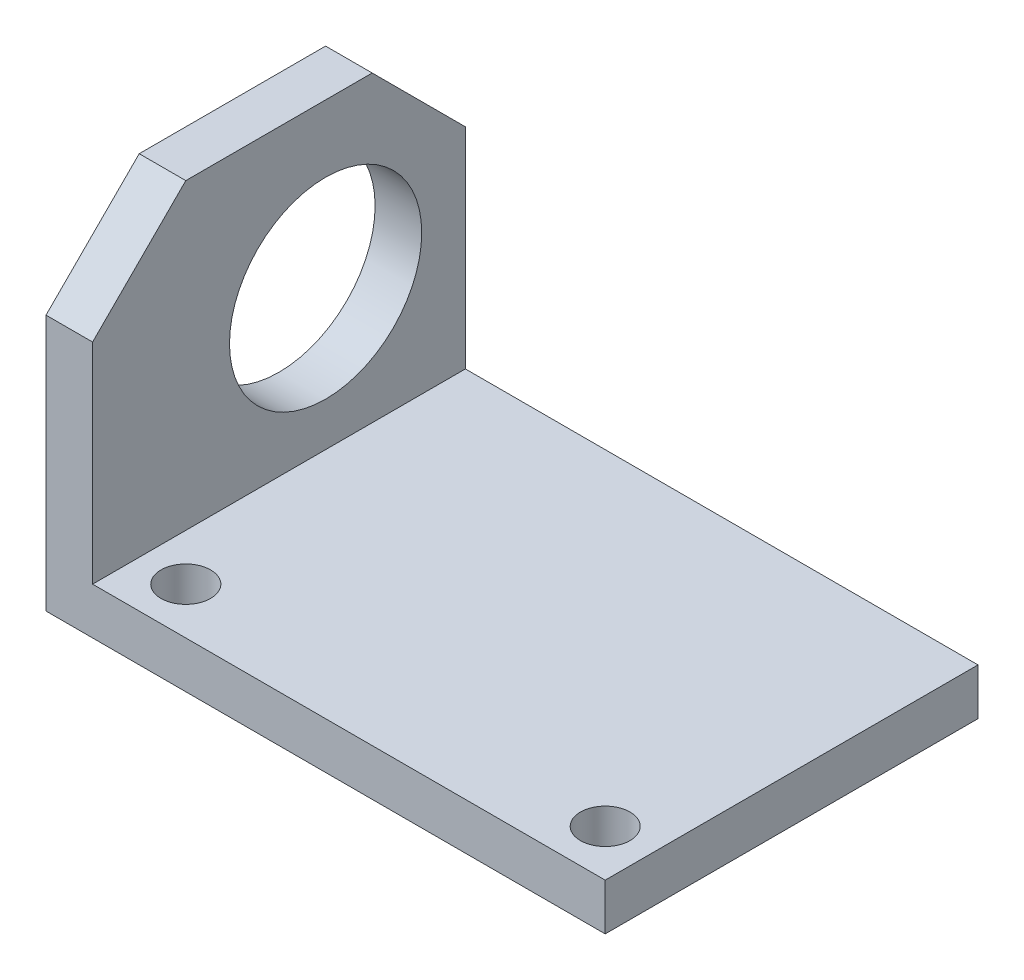
ISO-10303-21;
HEADER;
FILE_DESCRIPTION(('STEP AP214'),'2;1');
FILE_NAME('part.step','',(''),(''),'','','');
FILE_SCHEMA(('AUTOMOTIVE_DESIGN { 1 0 10303 214 1 1 1 1 }'));
ENDSEC;
DATA;
#1=APPLICATION_CONTEXT('core data for automotive mechanical design processes');
#2=APPLICATION_PROTOCOL_DEFINITION('international standard','automotive_design',2000,#1);
#3=PRODUCT_CONTEXT('',#1,'mechanical');
#4=PRODUCT('Part','Part','',(#3));
#5=PRODUCT_RELATED_PRODUCT_CATEGORY('part','',(#4));
#6=PRODUCT_DEFINITION_FORMATION('','',#4);
#7=PRODUCT_DEFINITION_CONTEXT('part definition',#1,'design');
#8=PRODUCT_DEFINITION('design','',#6,#7);
#9=PRODUCT_DEFINITION_SHAPE('','',#8);
#10=(LENGTH_UNIT() NAMED_UNIT(*) SI_UNIT(.MILLI.,.METRE.));
#11=(NAMED_UNIT(*) PLANE_ANGLE_UNIT() SI_UNIT($,.RADIAN.));
#12=(NAMED_UNIT(*) SI_UNIT($,.STERADIAN.) SOLID_ANGLE_UNIT());
#13=UNCERTAINTY_MEASURE_WITH_UNIT(LENGTH_MEASURE(1.E-05),#10,'distance_accuracy_value','');
#14=(GEOMETRIC_REPRESENTATION_CONTEXT(3) GLOBAL_UNCERTAINTY_ASSIGNED_CONTEXT((#13)) GLOBAL_UNIT_ASSIGNED_CONTEXT((#10,
#11,#12)) REPRESENTATION_CONTEXT('',''));
#15=CARTESIAN_POINT('',(0.,0.,0.));
#16=DIRECTION('',(0.,0.,1.));
#17=DIRECTION('',(1.,0.,0.));
#18=AXIS2_PLACEMENT_3D('',#15,#16,#17);
#19=CARTESIAN_POINT('',(0.,47.625,25.4));
#20=DIRECTION('',(1.,0.,0.));
#21=DIRECTION('',(0.,0.,-1.));
#22=AXIS2_PLACEMENT_3D('',#19,#20,#21);
#23=PLANE('',#22);
#24=CARTESIAN_POINT('',(0.,25.4,-6.35));
#25=DIRECTION('',(-1.,0.,0.));
#26=DIRECTION('',(0.,0.,1.));
#27=AXIS2_PLACEMENT_3D('',#24,#25,#26);
#28=CIRCLE('',#27,13.09624);
#29=CARTESIAN_POINT('',(0.,25.4,6.74624));
#30=VERTEX_POINT('',#29);
#31=EDGE_CURVE('E136',#30,#30,#28,.T.);
#32=ORIENTED_EDGE('',*,*,#31,.F.);
#33=EDGE_LOOP('',(#32));
#34=FACE_BOUND('',#33,.T.);
#35=DIRECTION('',(0.,0.,-1.));
#36=VECTOR('',#35,1.);
#37=CARTESIAN_POINT('',(0.,47.625,25.4));
#38=LINE('',#37,#36);
#39=CARTESIAN_POINT('',(0.,47.625,12.7));
#40=VERTEX_POINT('',#39);
#41=CARTESIAN_POINT('',(0.,47.625,-12.7));
#42=VERTEX_POINT('',#41);
#43=EDGE_CURVE('E157',#40,#42,#38,.T.);
#44=ORIENTED_EDGE('',*,*,#43,.T.);
#45=DIRECTION('',(0.,0.707106781186549,0.707106781186546));
#46=VECTOR('',#45,1.);
#47=CARTESIAN_POINT('',(0.,47.625,-12.7));
#48=LINE('',#47,#46);
#49=CARTESIAN_POINT('',(0.,34.9249999999999,-25.4));
#50=VERTEX_POINT('',#49);
#51=EDGE_CURVE('E142',#42,#50,#48,.F.);
#52=ORIENTED_EDGE('',*,*,#51,.T.);
#53=DIRECTION('',(0.,-1.,0.));
#54=VECTOR('',#53,1.);
#55=CARTESIAN_POINT('',(0.,47.625,-25.4));
#56=LINE('',#55,#54);
#57=CARTESIAN_POINT('',(0.,0.,-25.4));
#58=VERTEX_POINT('',#57);
#59=EDGE_CURVE('E123',#50,#58,#56,.T.);
#60=ORIENTED_EDGE('',*,*,#59,.T.);
#61=DIRECTION('',(0.,0.,-1.));
#62=VECTOR('',#61,1.);
#63=CARTESIAN_POINT('',(0.,0.,25.4));
#64=LINE('',#63,#62);
#65=CARTESIAN_POINT('',(0.,0.,25.4));
#66=VERTEX_POINT('',#65);
#67=EDGE_CURVE('E116',#66,#58,#64,.T.);
#68=ORIENTED_EDGE('',*,*,#67,.F.);
#69=DIRECTION('',(0.,-1.,0.));
#70=VECTOR('',#69,1.);
#71=CARTESIAN_POINT('',(0.,47.625,25.4));
#72=LINE('',#71,#70);
#73=CARTESIAN_POINT('',(0.,34.925,25.4));
#74=VERTEX_POINT('',#73);
#75=EDGE_CURVE('E103',#74,#66,#72,.T.);
#76=ORIENTED_EDGE('',*,*,#75,.F.);
#77=DIRECTION('',(0.,0.707106781186547,-0.707106781186548));
#78=VECTOR('',#77,1.);
#79=CARTESIAN_POINT('',(0.,34.925,25.4));
#80=LINE('',#79,#78);
#81=EDGE_CURVE('E140',#74,#40,#80,.T.);
#82=ORIENTED_EDGE('',*,*,#81,.T.);
#83=EDGE_LOOP('',(#44,#52,#60,#68,#76,#82));
#84=FACE_BOUND('',#83,.T.);
#85=ADVANCED_FACE('F35',(#34,#84),#23,.F.);
#86=CARTESIAN_POINT('',(0.,0.,25.4));
#87=DIRECTION('',(0.,1.,0.));
#88=DIRECTION('',(0.,0.,1.));
#89=AXIS2_PLACEMENT_3D('',#86,#87,#88);
#90=PLANE('',#89);
#91=CARTESIAN_POINT('',(12.7,0.,19.05));
#92=DIRECTION('',(0.,-1.,0.));
#93=DIRECTION('',(0.,0.,-1.));
#94=AXIS2_PLACEMENT_3D('',#91,#92,#93);
#95=CIRCLE('',#94,3.37819999999999);
#96=CARTESIAN_POINT('',(12.7,0.,15.6718));
#97=VERTEX_POINT('',#96);
#98=EDGE_CURVE('E135',#97,#97,#95,.T.);
#99=ORIENTED_EDGE('',*,*,#98,.F.);
#100=EDGE_LOOP('',(#99));
#101=FACE_BOUND('',#100,.T.);
#102=CARTESIAN_POINT('',(69.85,0.,19.05));
#103=DIRECTION('',(0.,-1.,0.));
#104=DIRECTION('',(0.,0.,-1.));
#105=AXIS2_PLACEMENT_3D('',#102,#103,#104);
#106=CIRCLE('',#105,3.37819999999998);
#107=CARTESIAN_POINT('',(69.85,0.,15.6718));
#108=VERTEX_POINT('',#107);
#109=EDGE_CURVE('E168',#108,#108,#106,.T.);
#110=ORIENTED_EDGE('',*,*,#109,.F.);
#111=EDGE_LOOP('',(#110));
#112=FACE_BOUND('',#111,.T.);
#113=DIRECTION('',(1.,0.,0.));
#114=VECTOR('',#113,1.);
#115=CARTESIAN_POINT('',(0.,0.,-25.4));
#116=LINE('',#115,#114);
#117=CARTESIAN_POINT('',(76.2,0.,-25.4));
#118=VERTEX_POINT('',#117);
#119=EDGE_CURVE('E162',#58,#118,#116,.T.);
#120=ORIENTED_EDGE('',*,*,#119,.T.);
#121=DIRECTION('',(0.,0.,-1.));
#122=VECTOR('',#121,1.);
#123=CARTESIAN_POINT('',(76.2,0.,25.4));
#124=LINE('',#123,#122);
#125=CARTESIAN_POINT('',(76.2,0.,25.4));
#126=VERTEX_POINT('',#125);
#127=EDGE_CURVE('E118',#126,#118,#124,.T.);
#128=ORIENTED_EDGE('',*,*,#127,.F.);
#129=DIRECTION('',(1.,0.,0.));
#130=VECTOR('',#129,1.);
#131=CARTESIAN_POINT('',(0.,0.,25.4));
#132=LINE('',#131,#130);
#133=EDGE_CURVE('E106',#66,#126,#132,.T.);
#134=ORIENTED_EDGE('',*,*,#133,.F.);
#135=ORIENTED_EDGE('',*,*,#67,.T.);
#136=EDGE_LOOP('',(#120,#128,#134,#135));
#137=FACE_BOUND('',#136,.T.);
#138=ADVANCED_FACE('F115',(#101,#112,#137),#90,.F.);
#139=CARTESIAN_POINT('',(76.2,0.,25.4));
#140=DIRECTION('',(-1.,0.,0.));
#141=DIRECTION('',(0.,0.,1.));
#142=AXIS2_PLACEMENT_3D('',#139,#140,#141);
#143=PLANE('',#142);
#144=DIRECTION('',(0.,1.,0.));
#145=VECTOR('',#144,1.);
#146=CARTESIAN_POINT('',(76.2,0.,-25.4));
#147=LINE('',#146,#145);
#148=CARTESIAN_POINT('',(76.2,6.35,-25.4));
#149=VERTEX_POINT('',#148);
#150=EDGE_CURVE('E165',#118,#149,#147,.T.);
#151=ORIENTED_EDGE('',*,*,#150,.T.);
#152=DIRECTION('',(0.,0.,-1.));
#153=VECTOR('',#152,1.);
#154=CARTESIAN_POINT('',(76.2,6.35,25.4));
#155=LINE('',#154,#153);
#156=CARTESIAN_POINT('',(76.2,6.35,25.4));
#157=VERTEX_POINT('',#156);
#158=EDGE_CURVE('E129',#157,#149,#155,.T.);
#159=ORIENTED_EDGE('',*,*,#158,.F.);
#160=DIRECTION('',(0.,1.,0.));
#161=VECTOR('',#160,1.);
#162=CARTESIAN_POINT('',(76.2,0.,25.4));
#163=LINE('',#162,#161);
#164=EDGE_CURVE('E120',#126,#157,#163,.T.);
#165=ORIENTED_EDGE('',*,*,#164,.F.);
#166=ORIENTED_EDGE('',*,*,#127,.T.);
#167=EDGE_LOOP('',(#151,#159,#165,#166));
#168=FACE_BOUND('',#167,.T.);
#169=ADVANCED_FACE('F188',(#168),#143,.F.);
#170=CARTESIAN_POINT('',(76.2,6.35,25.4));
#171=DIRECTION('',(0.,-1.,0.));
#172=DIRECTION('',(1.,0.,0.));
#173=AXIS2_PLACEMENT_3D('',#170,#171,#172);
#174=PLANE('',#173);
#175=CARTESIAN_POINT('',(12.7,6.34999999999999,19.05));
#176=DIRECTION('',(0.,-1.,0.));
#177=DIRECTION('',(1.,0.,0.));
#178=AXIS2_PLACEMENT_3D('',#175,#176,#177);
#179=CIRCLE('',#178,3.37819999999999);
#180=CARTESIAN_POINT('',(16.0782,6.34999999999999,19.05));
#181=VERTEX_POINT('',#180);
#182=EDGE_CURVE('E193',#181,#181,#179,.T.);
#183=ORIENTED_EDGE('',*,*,#182,.T.);
#184=EDGE_LOOP('',(#183));
#185=FACE_BOUND('',#184,.T.);
#186=CARTESIAN_POINT('',(69.85,6.35,19.05));
#187=DIRECTION('',(0.,-1.,0.));
#188=DIRECTION('',(1.,0.,0.));
#189=AXIS2_PLACEMENT_3D('',#186,#187,#188);
#190=CIRCLE('',#189,3.37819999999998);
#191=CARTESIAN_POINT('',(73.2282,6.35,19.05));
#192=VERTEX_POINT('',#191);
#193=EDGE_CURVE('E163',#192,#192,#190,.T.);
#194=ORIENTED_EDGE('',*,*,#193,.T.);
#195=EDGE_LOOP('',(#194));
#196=FACE_BOUND('',#195,.T.);
#197=DIRECTION('',(-1.,0.,0.));
#198=VECTOR('',#197,1.);
#199=CARTESIAN_POINT('',(76.2,6.35,-25.4));
#200=LINE('',#199,#198);
#201=CARTESIAN_POINT('',(6.35,6.34999999999999,-25.4));
#202=VERTEX_POINT('',#201);
#203=EDGE_CURVE('E175',#149,#202,#200,.T.);
#204=ORIENTED_EDGE('',*,*,#203,.T.);
#205=DIRECTION('',(0.,0.,-1.));
#206=VECTOR('',#205,1.);
#207=CARTESIAN_POINT('',(6.35,6.34999999999999,25.4));
#208=LINE('',#207,#206);
#209=CARTESIAN_POINT('',(6.35,6.34999999999999,25.4));
#210=VERTEX_POINT('',#209);
#211=EDGE_CURVE('E156',#210,#202,#208,.T.);
#212=ORIENTED_EDGE('',*,*,#211,.F.);
#213=DIRECTION('',(-1.,0.,0.));
#214=VECTOR('',#213,1.);
#215=CARTESIAN_POINT('',(76.2,6.35,25.4));
#216=LINE('',#215,#214);
#217=EDGE_CURVE('E186',#157,#210,#216,.T.);
#218=ORIENTED_EDGE('',*,*,#217,.F.);
#219=ORIENTED_EDGE('',*,*,#158,.T.);
#220=EDGE_LOOP('',(#204,#212,#218,#219));
#221=FACE_BOUND('',#220,.T.);
#222=ADVANCED_FACE('F184',(#185,#196,#221),#174,.F.);
#223=CARTESIAN_POINT('',(6.35,6.34999999999999,25.4));
#224=DIRECTION('',(-1.,0.,0.));
#225=DIRECTION('',(0.,-1.,0.));
#226=AXIS2_PLACEMENT_3D('',#223,#224,#225);
#227=PLANE('',#226);
#228=CARTESIAN_POINT('',(6.35,25.4,-6.35));
#229=DIRECTION('',(-1.,0.,0.));
#230=DIRECTION('',(0.,-1.,0.));
#231=AXIS2_PLACEMENT_3D('',#228,#229,#230);
#232=CIRCLE('',#231,13.09624);
#233=CARTESIAN_POINT('',(6.35,12.30376,-6.35));
#234=VERTEX_POINT('',#233);
#235=EDGE_CURVE('E133',#234,#234,#232,.T.);
#236=ORIENTED_EDGE('',*,*,#235,.T.);
#237=EDGE_LOOP('',(#236));
#238=FACE_BOUND('',#237,.T.);
#239=DIRECTION('',(0.,1.,0.));
#240=VECTOR('',#239,1.);
#241=CARTESIAN_POINT('',(6.35,6.34999999999999,-25.4));
#242=LINE('',#241,#240);
#243=CARTESIAN_POINT('',(6.35,34.9249999999999,-25.4));
#244=VERTEX_POINT('',#243);
#245=EDGE_CURVE('E111',#202,#244,#242,.T.);
#246=ORIENTED_EDGE('',*,*,#245,.T.);
#247=DIRECTION('',(0.,-0.707106781186549,-0.707106781186546));
#248=VECTOR('',#247,1.);
#249=CARTESIAN_POINT('',(6.35,47.625,-12.7));
#250=LINE('',#249,#248);
#251=CARTESIAN_POINT('',(6.35,47.625,-12.7));
#252=VERTEX_POINT('',#251);
#253=EDGE_CURVE('E43',#244,#252,#250,.F.);
#254=ORIENTED_EDGE('',*,*,#253,.T.);
#255=DIRECTION('',(0.,0.,-1.));
#256=VECTOR('',#255,1.);
#257=CARTESIAN_POINT('',(6.35,47.625,25.4));
#258=LINE('',#257,#256);
#259=CARTESIAN_POINT('',(6.35,47.625,12.7));
#260=VERTEX_POINT('',#259);
#261=EDGE_CURVE('E148',#260,#252,#258,.T.);
#262=ORIENTED_EDGE('',*,*,#261,.F.);
#263=DIRECTION('',(0.,-0.707106781186547,0.707106781186548));
#264=VECTOR('',#263,1.);
#265=CARTESIAN_POINT('',(6.35,34.925,25.4));
#266=LINE('',#265,#264);
#267=CARTESIAN_POINT('',(6.35,34.925,25.4));
#268=VERTEX_POINT('',#267);
#269=EDGE_CURVE('E50',#260,#268,#266,.T.);
#270=ORIENTED_EDGE('',*,*,#269,.T.);
#271=DIRECTION('',(0.,1.,0.));
#272=VECTOR('',#271,1.);
#273=CARTESIAN_POINT('',(6.35,6.34999999999999,25.4));
#274=LINE('',#273,#272);
#275=EDGE_CURVE('E171',#210,#268,#274,.T.);
#276=ORIENTED_EDGE('',*,*,#275,.F.);
#277=ORIENTED_EDGE('',*,*,#211,.T.);
#278=EDGE_LOOP('',(#246,#254,#262,#270,#276,#277));
#279=FACE_BOUND('',#278,.T.);
#280=ADVANCED_FACE('F147',(#238,#279),#227,.F.);
#281=CARTESIAN_POINT('',(6.35,47.625,25.4));
#282=DIRECTION('',(0.,-1.,0.));
#283=DIRECTION('',(0.,0.,-1.));
#284=AXIS2_PLACEMENT_3D('',#281,#282,#283);
#285=PLANE('',#284);
#286=ORIENTED_EDGE('',*,*,#261,.T.);
#287=DIRECTION('',(-1.,0.,0.));
#288=VECTOR('',#287,1.);
#289=CARTESIAN_POINT('',(6.35,47.625,-12.7));
#290=LINE('',#289,#288);
#291=EDGE_CURVE('E127',#252,#42,#290,.T.);
#292=ORIENTED_EDGE('',*,*,#291,.T.);
#293=ORIENTED_EDGE('',*,*,#43,.F.);
#294=DIRECTION('',(1.,0.,0.));
#295=VECTOR('',#294,1.);
#296=CARTESIAN_POINT('',(6.35,47.625,12.7));
#297=LINE('',#296,#295);
#298=EDGE_CURVE('E125',#40,#260,#297,.T.);
#299=ORIENTED_EDGE('',*,*,#298,.T.);
#300=EDGE_LOOP('',(#286,#292,#293,#299));
#301=FACE_BOUND('',#300,.T.);
#302=ADVANCED_FACE('F153',(#301),#285,.F.);
#303=CARTESIAN_POINT('',(0.,0.,25.4));
#304=DIRECTION('',(0.,0.,1.));
#305=DIRECTION('',(1.,0.,0.));
#306=AXIS2_PLACEMENT_3D('',#303,#304,#305);
#307=PLANE('',#306);
#308=ORIENTED_EDGE('',*,*,#275,.T.);
#309=DIRECTION('',(-1.,0.,0.));
#310=VECTOR('',#309,1.);
#311=CARTESIAN_POINT('',(0.,34.925,25.4));
#312=LINE('',#311,#310);
#313=EDGE_CURVE('E11',#268,#74,#312,.T.);
#314=ORIENTED_EDGE('',*,*,#313,.T.);
#315=ORIENTED_EDGE('',*,*,#75,.T.);
#316=ORIENTED_EDGE('',*,*,#133,.T.);
#317=ORIENTED_EDGE('',*,*,#164,.T.);
#318=ORIENTED_EDGE('',*,*,#217,.T.);
#319=EDGE_LOOP('',(#308,#314,#315,#316,#317,#318));
#320=FACE_BOUND('',#319,.T.);
#321=ADVANCED_FACE('F105',(#320),#307,.T.);
#322=CARTESIAN_POINT('',(0.,0.,-25.4));
#323=DIRECTION('',(0.,0.,1.));
#324=DIRECTION('',(1.,0.,0.));
#325=AXIS2_PLACEMENT_3D('',#322,#323,#324);
#326=PLANE('',#325);
#327=ORIENTED_EDGE('',*,*,#59,.F.);
#328=DIRECTION('',(1.,0.,0.));
#329=VECTOR('',#328,1.);
#330=CARTESIAN_POINT('',(0.,34.9249999999999,-25.4));
#331=LINE('',#330,#329);
#332=EDGE_CURVE('E58',#50,#244,#331,.T.);
#333=ORIENTED_EDGE('',*,*,#332,.T.);
#334=ORIENTED_EDGE('',*,*,#245,.F.);
#335=ORIENTED_EDGE('',*,*,#203,.F.);
#336=ORIENTED_EDGE('',*,*,#150,.F.);
#337=ORIENTED_EDGE('',*,*,#119,.F.);
#338=EDGE_LOOP('',(#327,#333,#334,#335,#336,#337));
#339=FACE_BOUND('',#338,.T.);
#340=ADVANCED_FACE('F160',(#339),#326,.F.);
#341=CARTESIAN_POINT('',(69.85,0.,19.05));
#342=DIRECTION('',(0.,-1.,0.));
#343=DIRECTION('',(0.,0.,-1.));
#344=AXIS2_PLACEMENT_3D('',#341,#342,#343);
#345=CYLINDRICAL_SURFACE('',#344,3.37819999999998);
#346=ORIENTED_EDGE('',*,*,#109,.T.);
#347=EDGE_LOOP('',(#346));
#348=FACE_BOUND('',#347,.T.);
#349=ORIENTED_EDGE('',*,*,#193,.F.);
#350=EDGE_LOOP('',(#349));
#351=FACE_BOUND('',#350,.T.);
#352=ADVANCED_FACE('F223',(#348,#351),#345,.F.);
#353=CARTESIAN_POINT('',(12.7,0.,19.05));
#354=DIRECTION('',(0.,-1.,0.));
#355=DIRECTION('',(0.,0.,-1.));
#356=AXIS2_PLACEMENT_3D('',#353,#354,#355);
#357=CYLINDRICAL_SURFACE('',#356,3.37819999999999);
#358=ORIENTED_EDGE('',*,*,#98,.T.);
#359=EDGE_LOOP('',(#358));
#360=FACE_BOUND('',#359,.T.);
#361=ORIENTED_EDGE('',*,*,#182,.F.);
#362=EDGE_LOOP('',(#361));
#363=FACE_BOUND('',#362,.T.);
#364=ADVANCED_FACE('F218',(#360,#363),#357,.F.);
#365=CARTESIAN_POINT('',(0.,25.4,-6.35));
#366=DIRECTION('',(-1.,0.,0.));
#367=DIRECTION('',(0.,0.,1.));
#368=AXIS2_PLACEMENT_3D('',#365,#366,#367);
#369=CYLINDRICAL_SURFACE('',#368,13.09624);
#370=ORIENTED_EDGE('',*,*,#31,.T.);
#371=EDGE_LOOP('',(#370));
#372=FACE_BOUND('',#371,.T.);
#373=ORIENTED_EDGE('',*,*,#235,.F.);
#374=EDGE_LOOP('',(#373));
#375=FACE_BOUND('',#374,.T.);
#376=ADVANCED_FACE('F201',(#372,#375),#369,.F.);
#377=CARTESIAN_POINT('',(6.35,47.625,-12.7));
#378=DIRECTION('',(0.,-0.707106781186546,0.707106781186549));
#379=DIRECTION('',(-1.,0.,0.));
#380=AXIS2_PLACEMENT_3D('',#377,#378,#379);
#381=PLANE('',#380);
#382=ORIENTED_EDGE('',*,*,#253,.F.);
#383=ORIENTED_EDGE('',*,*,#332,.F.);
#384=ORIENTED_EDGE('',*,*,#51,.F.);
#385=ORIENTED_EDGE('',*,*,#291,.F.);
#386=EDGE_LOOP('',(#382,#383,#384,#385));
#387=FACE_BOUND('',#386,.T.);
#388=ADVANCED_FACE('F159',(#387),#381,.F.);
#389=CARTESIAN_POINT('',(0.,34.925,25.4));
#390=DIRECTION('',(0.,0.707106781186548,0.707106781186547));
#391=DIRECTION('',(1.,0.,0.));
#392=AXIS2_PLACEMENT_3D('',#389,#390,#391);
#393=PLANE('',#392);
#394=ORIENTED_EDGE('',*,*,#269,.F.);
#395=ORIENTED_EDGE('',*,*,#298,.F.);
#396=ORIENTED_EDGE('',*,*,#81,.F.);
#397=ORIENTED_EDGE('',*,*,#313,.F.);
#398=EDGE_LOOP('',(#394,#395,#396,#397));
#399=FACE_BOUND('',#398,.T.);
#400=ADVANCED_FACE('F37',(#399),#393,.T.);
#401=CLOSED_SHELL('',(#85,#138,#169,#222,#280,#302,#321,#340,#352,#364,#376,#388,#400));
#402=MANIFOLD_SOLID_BREP('B2',#401);
#403=ADVANCED_BREP_SHAPE_REPRESENTATION('',(#18,#402),#14);
#404=SHAPE_DEFINITION_REPRESENTATION(#9,#403);
ENDSEC;
END-ISO-10303-21;
